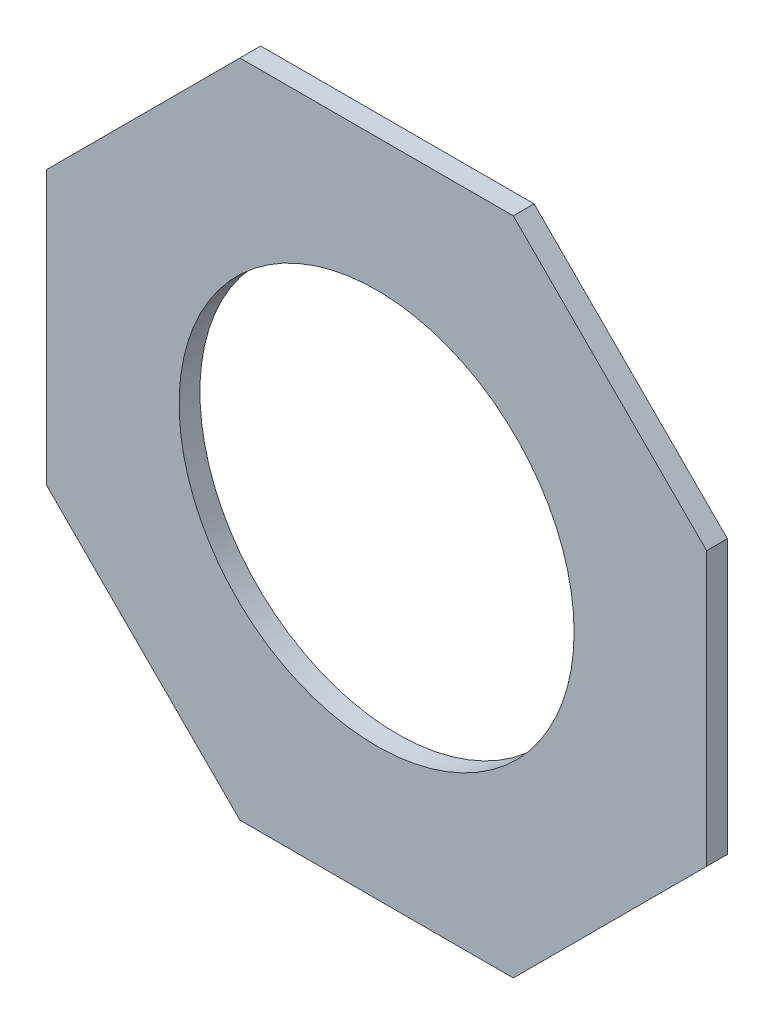
ISO-10303-21;
HEADER;
FILE_DESCRIPTION(('STEP AP214'),'2;1');
FILE_NAME('part.step','',(''),(''),'','','');
FILE_SCHEMA(('AUTOMOTIVE_DESIGN { 1 0 10303 214 1 1 1 1 }'));
ENDSEC;
DATA;
#1=APPLICATION_CONTEXT('core data for automotive mechanical design processes');
#2=APPLICATION_PROTOCOL_DEFINITION('international standard','automotive_design',2000,#1);
#3=PRODUCT_CONTEXT('',#1,'mechanical');
#4=PRODUCT('Part','Part','',(#3));
#5=PRODUCT_RELATED_PRODUCT_CATEGORY('part','',(#4));
#6=PRODUCT_DEFINITION_FORMATION('','',#4);
#7=PRODUCT_DEFINITION_CONTEXT('part definition',#1,'design');
#8=PRODUCT_DEFINITION('design','',#6,#7);
#9=PRODUCT_DEFINITION_SHAPE('','',#8);
#10=(LENGTH_UNIT() NAMED_UNIT(*) SI_UNIT(.MILLI.,.METRE.));
#11=(NAMED_UNIT(*) PLANE_ANGLE_UNIT() SI_UNIT($,.RADIAN.));
#12=(NAMED_UNIT(*) SI_UNIT($,.STERADIAN.) SOLID_ANGLE_UNIT());
#13=UNCERTAINTY_MEASURE_WITH_UNIT(LENGTH_MEASURE(1.E-05),#10,'distance_accuracy_value','');
#14=(GEOMETRIC_REPRESENTATION_CONTEXT(3) GLOBAL_UNCERTAINTY_ASSIGNED_CONTEXT((#13)) GLOBAL_UNIT_ASSIGNED_CONTEXT((#10,
#11,#12)) REPRESENTATION_CONTEXT('',''));
#15=CARTESIAN_POINT('',(0.,0.,0.));
#16=DIRECTION('',(0.,0.,1.));
#17=DIRECTION('',(1.,0.,0.));
#18=AXIS2_PLACEMENT_3D('',#15,#16,#17);
#19=CARTESIAN_POINT('',(0.,0.,1.));
#20=DIRECTION('',(0.,0.,1.));
#21=DIRECTION('',(1.,0.,0.));
#22=AXIS2_PLACEMENT_3D('',#19,#20,#21);
#23=PLANE('',#22);
#24=DIRECTION('',(-0.707106781186547,0.707106781186548,0.));
#25=VECTOR('',#24,1.);
#26=CARTESIAN_POINT('',(15.875,6.57564030267289,1.));
#27=LINE('',#26,#25);
#28=CARTESIAN_POINT('',(15.875,6.57564030267289,1.));
#29=VERTEX_POINT('',#28);
#30=CARTESIAN_POINT('',(6.57564030267289,15.875,1.));
#31=VERTEX_POINT('',#30);
#32=EDGE_CURVE('E145',#29,#31,#27,.T.);
#33=ORIENTED_EDGE('',*,*,#32,.T.);
#34=DIRECTION('',(-1.,0.,0.));
#35=VECTOR('',#34,1.);
#36=CARTESIAN_POINT('',(6.57564030267289,15.875,1.));
#37=LINE('',#36,#35);
#38=CARTESIAN_POINT('',(-6.57564030267288,15.875,1.));
#39=VERTEX_POINT('',#38);
#40=EDGE_CURVE('E93',#31,#39,#37,.T.);
#41=ORIENTED_EDGE('',*,*,#40,.T.);
#42=DIRECTION('',(-0.707106781186548,-0.707106781186548,0.));
#43=VECTOR('',#42,1.);
#44=CARTESIAN_POINT('',(-6.57564030267288,15.875,1.));
#45=LINE('',#44,#43);
#46=CARTESIAN_POINT('',(-15.875,6.57564030267288,1.));
#47=VERTEX_POINT('',#46);
#48=EDGE_CURVE('E160',#39,#47,#45,.T.);
#49=ORIENTED_EDGE('',*,*,#48,.T.);
#50=DIRECTION('',(0.,-1.,0.));
#51=VECTOR('',#50,1.);
#52=CARTESIAN_POINT('',(-15.875,6.57564030267288,1.));
#53=LINE('',#52,#51);
#54=CARTESIAN_POINT('',(-15.875,-6.57564030267288,1.));
#55=VERTEX_POINT('',#54);
#56=EDGE_CURVE('E173',#47,#55,#53,.T.);
#57=ORIENTED_EDGE('',*,*,#56,.T.);
#58=DIRECTION('',(0.707106781186548,-0.707106781186548,0.));
#59=VECTOR('',#58,1.);
#60=CARTESIAN_POINT('',(-15.875,-6.57564030267288,1.));
#61=LINE('',#60,#59);
#62=CARTESIAN_POINT('',(-6.57564030267289,-15.875,1.));
#63=VERTEX_POINT('',#62);
#64=EDGE_CURVE('E112',#55,#63,#61,.T.);
#65=ORIENTED_EDGE('',*,*,#64,.T.);
#66=DIRECTION('',(1.,0.,0.));
#67=VECTOR('',#66,1.);
#68=CARTESIAN_POINT('',(-6.57564030267289,-15.875,1.));
#69=LINE('',#68,#67);
#70=CARTESIAN_POINT('',(6.57564030267288,-15.875,1.));
#71=VERTEX_POINT('',#70);
#72=EDGE_CURVE('E106',#63,#71,#69,.T.);
#73=ORIENTED_EDGE('',*,*,#72,.T.);
#74=DIRECTION('',(0.707106781186548,0.707106781186547,0.));
#75=VECTOR('',#74,1.);
#76=CARTESIAN_POINT('',(6.57564030267288,-15.875,1.));
#77=LINE('',#76,#75);
#78=CARTESIAN_POINT('',(15.875,-6.57564030267289,1.));
#79=VERTEX_POINT('',#78);
#80=EDGE_CURVE('E110',#71,#79,#77,.T.);
#81=ORIENTED_EDGE('',*,*,#80,.T.);
#82=DIRECTION('',(0.,1.,0.));
#83=VECTOR('',#82,1.);
#84=CARTESIAN_POINT('',(15.875,-6.57564030267289,1.));
#85=LINE('',#84,#83);
#86=EDGE_CURVE('E50',#79,#29,#85,.T.);
#87=ORIENTED_EDGE('',*,*,#86,.T.);
#88=EDGE_LOOP('',(#33,#41,#49,#57,#65,#73,#81,#87));
#89=FACE_BOUND('',#88,.T.);
#90=CARTESIAN_POINT('',(0.,0.,1.));
#91=DIRECTION('',(0.,0.,1.));
#92=DIRECTION('',(1.,0.,0.));
#93=AXIS2_PLACEMENT_3D('',#90,#91,#92);
#94=CIRCLE('',#93,9.5);
#95=CARTESIAN_POINT('',(9.5,0.,1.));
#96=VERTEX_POINT('',#95);
#97=EDGE_CURVE('E134',#96,#96,#94,.T.);
#98=ORIENTED_EDGE('',*,*,#97,.F.);
#99=EDGE_LOOP('',(#98));
#100=FACE_BOUND('',#99,.T.);
#101=ADVANCED_FACE('F33',(#89,#100),#23,.T.);
#102=CARTESIAN_POINT('',(0.,0.,0.));
#103=DIRECTION('',(0.,0.,1.));
#104=DIRECTION('',(1.,0.,0.));
#105=AXIS2_PLACEMENT_3D('',#102,#103,#104);
#106=PLANE('',#105);
#107=DIRECTION('',(-0.707106781186547,0.707106781186548,0.));
#108=VECTOR('',#107,1.);
#109=CARTESIAN_POINT('',(15.875,6.57564030267289,0.));
#110=LINE('',#109,#108);
#111=CARTESIAN_POINT('',(15.875,6.57564030267289,0.));
#112=VERTEX_POINT('',#111);
#113=CARTESIAN_POINT('',(6.57564030267289,15.875,0.));
#114=VERTEX_POINT('',#113);
#115=EDGE_CURVE('E130',#112,#114,#110,.T.);
#116=ORIENTED_EDGE('',*,*,#115,.F.);
#117=DIRECTION('',(0.,1.,0.));
#118=VECTOR('',#117,1.);
#119=CARTESIAN_POINT('',(15.875,-6.57564030267289,0.));
#120=LINE('',#119,#118);
#121=CARTESIAN_POINT('',(15.875,-6.57564030267289,0.));
#122=VERTEX_POINT('',#121);
#123=EDGE_CURVE('E85',#122,#112,#120,.T.);
#124=ORIENTED_EDGE('',*,*,#123,.F.);
#125=DIRECTION('',(0.707106781186548,0.707106781186547,0.));
#126=VECTOR('',#125,1.);
#127=CARTESIAN_POINT('',(6.57564030267288,-15.875,0.));
#128=LINE('',#127,#126);
#129=CARTESIAN_POINT('',(6.57564030267288,-15.875,0.));
#130=VERTEX_POINT('',#129);
#131=EDGE_CURVE('E79',#130,#122,#128,.T.);
#132=ORIENTED_EDGE('',*,*,#131,.F.);
#133=DIRECTION('',(1.,0.,0.));
#134=VECTOR('',#133,1.);
#135=CARTESIAN_POINT('',(-6.57564030267289,-15.875,0.));
#136=LINE('',#135,#134);
#137=CARTESIAN_POINT('',(-6.57564030267289,-15.875,0.));
#138=VERTEX_POINT('',#137);
#139=EDGE_CURVE('E120',#138,#130,#136,.T.);
#140=ORIENTED_EDGE('',*,*,#139,.F.);
#141=DIRECTION('',(0.707106781186548,-0.707106781186548,0.));
#142=VECTOR('',#141,1.);
#143=CARTESIAN_POINT('',(-15.875,-6.57564030267288,0.));
#144=LINE('',#143,#142);
#145=CARTESIAN_POINT('',(-15.875,-6.57564030267288,0.));
#146=VERTEX_POINT('',#145);
#147=EDGE_CURVE('E140',#146,#138,#144,.T.);
#148=ORIENTED_EDGE('',*,*,#147,.F.);
#149=DIRECTION('',(0.,-1.,0.));
#150=VECTOR('',#149,1.);
#151=CARTESIAN_POINT('',(-15.875,6.57564030267288,0.));
#152=LINE('',#151,#150);
#153=CARTESIAN_POINT('',(-15.875,6.57564030267288,0.));
#154=VERTEX_POINT('',#153);
#155=EDGE_CURVE('E138',#154,#146,#152,.T.);
#156=ORIENTED_EDGE('',*,*,#155,.F.);
#157=DIRECTION('',(-0.707106781186548,-0.707106781186548,0.));
#158=VECTOR('',#157,1.);
#159=CARTESIAN_POINT('',(-6.57564030267288,15.875,0.));
#160=LINE('',#159,#158);
#161=CARTESIAN_POINT('',(-6.57564030267288,15.875,0.));
#162=VERTEX_POINT('',#161);
#163=EDGE_CURVE('E136',#162,#154,#160,.T.);
#164=ORIENTED_EDGE('',*,*,#163,.F.);
#165=DIRECTION('',(-1.,0.,0.));
#166=VECTOR('',#165,1.);
#167=CARTESIAN_POINT('',(6.57564030267289,15.875,0.));
#168=LINE('',#167,#166);
#169=EDGE_CURVE('E133',#114,#162,#168,.T.);
#170=ORIENTED_EDGE('',*,*,#169,.F.);
#171=EDGE_LOOP('',(#116,#124,#132,#140,#148,#156,#164,#170));
#172=FACE_BOUND('',#171,.T.);
#173=CARTESIAN_POINT('',(0.,0.,0.));
#174=DIRECTION('',(0.,0.,1.));
#175=DIRECTION('',(1.,0.,0.));
#176=AXIS2_PLACEMENT_3D('',#173,#174,#175);
#177=CIRCLE('',#176,9.5);
#178=CARTESIAN_POINT('',(9.5,0.,0.));
#179=VERTEX_POINT('',#178);
#180=EDGE_CURVE('E179',#179,#179,#177,.T.);
#181=ORIENTED_EDGE('',*,*,#180,.T.);
#182=EDGE_LOOP('',(#181));
#183=FACE_BOUND('',#182,.T.);
#184=ADVANCED_FACE('F164',(#172,#183),#106,.F.);
#185=CARTESIAN_POINT('',(15.875,6.57564030267289,1.));
#186=DIRECTION('',(-0.707106781186548,-0.707106781186547,0.));
#187=DIRECTION('',(0.707106781186547,-0.707106781186548,0.));
#188=AXIS2_PLACEMENT_3D('',#185,#186,#187);
#189=PLANE('',#188);
#190=ORIENTED_EDGE('',*,*,#115,.T.);
#191=DIRECTION('',(0.,0.,-1.));
#192=VECTOR('',#191,1.);
#193=CARTESIAN_POINT('',(6.57564030267289,15.875,1.));
#194=LINE('',#193,#192);
#195=EDGE_CURVE('E11',#31,#114,#194,.T.);
#196=ORIENTED_EDGE('',*,*,#195,.F.);
#197=ORIENTED_EDGE('',*,*,#32,.F.);
#198=DIRECTION('',(0.,0.,-1.));
#199=VECTOR('',#198,1.);
#200=CARTESIAN_POINT('',(15.875,6.57564030267289,1.));
#201=LINE('',#200,#199);
#202=EDGE_CURVE('E126',#29,#112,#201,.T.);
#203=ORIENTED_EDGE('',*,*,#202,.T.);
#204=EDGE_LOOP('',(#190,#196,#197,#203));
#205=FACE_BOUND('',#204,.T.);
#206=ADVANCED_FACE('F35',(#205),#189,.F.);
#207=CARTESIAN_POINT('',(6.57564030267289,15.875,1.));
#208=DIRECTION('',(0.,-1.,0.));
#209=DIRECTION('',(0.,0.,-1.));
#210=AXIS2_PLACEMENT_3D('',#207,#208,#209);
#211=PLANE('',#210);
#212=ORIENTED_EDGE('',*,*,#169,.T.);
#213=DIRECTION('',(0.,0.,-1.));
#214=VECTOR('',#213,1.);
#215=CARTESIAN_POINT('',(-6.57564030267288,15.875,1.));
#216=LINE('',#215,#214);
#217=EDGE_CURVE('E42',#39,#162,#216,.T.);
#218=ORIENTED_EDGE('',*,*,#217,.F.);
#219=ORIENTED_EDGE('',*,*,#40,.F.);
#220=ORIENTED_EDGE('',*,*,#195,.T.);
#221=EDGE_LOOP('',(#212,#218,#219,#220));
#222=FACE_BOUND('',#221,.T.);
#223=ADVANCED_FACE('F207',(#222),#211,.F.);
#224=CARTESIAN_POINT('',(-6.57564030267288,15.875,1.));
#225=DIRECTION('',(0.707106781186547,-0.707106781186548,0.));
#226=DIRECTION('',(0.707106781186548,0.707106781186547,0.));
#227=AXIS2_PLACEMENT_3D('',#224,#225,#226);
#228=PLANE('',#227);
#229=ORIENTED_EDGE('',*,*,#163,.T.);
#230=DIRECTION('',(0.,0.,-1.));
#231=VECTOR('',#230,1.);
#232=CARTESIAN_POINT('',(-15.875,6.57564030267288,1.));
#233=LINE('',#232,#231);
#234=EDGE_CURVE('E152',#47,#154,#233,.T.);
#235=ORIENTED_EDGE('',*,*,#234,.F.);
#236=ORIENTED_EDGE('',*,*,#48,.F.);
#237=ORIENTED_EDGE('',*,*,#217,.T.);
#238=EDGE_LOOP('',(#229,#235,#236,#237));
#239=FACE_BOUND('',#238,.T.);
#240=ADVANCED_FACE('F158',(#239),#228,.F.);
#241=CARTESIAN_POINT('',(-15.875,6.57564030267288,1.));
#242=DIRECTION('',(1.,0.,0.));
#243=DIRECTION('',(0.,1.,0.));
#244=AXIS2_PLACEMENT_3D('',#241,#242,#243);
#245=PLANE('',#244);
#246=ORIENTED_EDGE('',*,*,#155,.T.);
#247=DIRECTION('',(0.,0.,-1.));
#248=VECTOR('',#247,1.);
#249=CARTESIAN_POINT('',(-15.875,-6.57564030267288,1.));
#250=LINE('',#249,#248);
#251=EDGE_CURVE('E149',#55,#146,#250,.T.);
#252=ORIENTED_EDGE('',*,*,#251,.F.);
#253=ORIENTED_EDGE('',*,*,#56,.F.);
#254=ORIENTED_EDGE('',*,*,#234,.T.);
#255=EDGE_LOOP('',(#246,#252,#253,#254));
#256=FACE_BOUND('',#255,.T.);
#257=ADVANCED_FACE('F169',(#256),#245,.F.);
#258=CARTESIAN_POINT('',(-15.875,-6.57564030267288,1.));
#259=DIRECTION('',(0.707106781186547,0.707106781186548,0.));
#260=DIRECTION('',(-0.707106781186548,0.707106781186547,0.));
#261=AXIS2_PLACEMENT_3D('',#258,#259,#260);
#262=PLANE('',#261);
#263=ORIENTED_EDGE('',*,*,#147,.T.);
#264=DIRECTION('',(0.,0.,-1.));
#265=VECTOR('',#264,1.);
#266=CARTESIAN_POINT('',(-6.57564030267289,-15.875,1.));
#267=LINE('',#266,#265);
#268=EDGE_CURVE('E121',#63,#138,#267,.T.);
#269=ORIENTED_EDGE('',*,*,#268,.F.);
#270=ORIENTED_EDGE('',*,*,#64,.F.);
#271=ORIENTED_EDGE('',*,*,#251,.T.);
#272=EDGE_LOOP('',(#263,#269,#270,#271));
#273=FACE_BOUND('',#272,.T.);
#274=ADVANCED_FACE('F172',(#273),#262,.F.);
#275=CARTESIAN_POINT('',(-6.57564030267289,-15.875,1.));
#276=DIRECTION('',(0.,1.,0.));
#277=DIRECTION('',(-1.,0.,0.));
#278=AXIS2_PLACEMENT_3D('',#275,#276,#277);
#279=PLANE('',#278);
#280=ORIENTED_EDGE('',*,*,#139,.T.);
#281=DIRECTION('',(0.,0.,-1.));
#282=VECTOR('',#281,1.);
#283=CARTESIAN_POINT('',(6.57564030267288,-15.875,1.));
#284=LINE('',#283,#282);
#285=EDGE_CURVE('E117',#71,#130,#284,.T.);
#286=ORIENTED_EDGE('',*,*,#285,.F.);
#287=ORIENTED_EDGE('',*,*,#72,.F.);
#288=ORIENTED_EDGE('',*,*,#268,.T.);
#289=EDGE_LOOP('',(#280,#286,#287,#288));
#290=FACE_BOUND('',#289,.T.);
#291=ADVANCED_FACE('F118',(#290),#279,.F.);
#292=CARTESIAN_POINT('',(6.57564030267288,-15.875,1.));
#293=DIRECTION('',(-0.707106781186547,0.707106781186548,0.));
#294=DIRECTION('',(-0.707106781186548,-0.707106781186547,0.));
#295=AXIS2_PLACEMENT_3D('',#292,#293,#294);
#296=PLANE('',#295);
#297=ORIENTED_EDGE('',*,*,#131,.T.);
#298=DIRECTION('',(0.,0.,-1.));
#299=VECTOR('',#298,1.);
#300=CARTESIAN_POINT('',(15.875,-6.57564030267289,1.));
#301=LINE('',#300,#299);
#302=EDGE_CURVE('E122',#79,#122,#301,.T.);
#303=ORIENTED_EDGE('',*,*,#302,.F.);
#304=ORIENTED_EDGE('',*,*,#80,.F.);
#305=ORIENTED_EDGE('',*,*,#285,.T.);
#306=EDGE_LOOP('',(#297,#303,#304,#305));
#307=FACE_BOUND('',#306,.T.);
#308=ADVANCED_FACE('F124',(#307),#296,.F.);
#309=CARTESIAN_POINT('',(15.875,-6.57564030267289,1.));
#310=DIRECTION('',(-1.,0.,0.));
#311=DIRECTION('',(0.,-1.,0.));
#312=AXIS2_PLACEMENT_3D('',#309,#310,#311);
#313=PLANE('',#312);
#314=ORIENTED_EDGE('',*,*,#123,.T.);
#315=ORIENTED_EDGE('',*,*,#202,.F.);
#316=ORIENTED_EDGE('',*,*,#86,.F.);
#317=ORIENTED_EDGE('',*,*,#302,.T.);
#318=EDGE_LOOP('',(#314,#315,#316,#317));
#319=FACE_BOUND('',#318,.T.);
#320=ADVANCED_FACE('F195',(#319),#313,.F.);
#321=CARTESIAN_POINT('',(0.,0.,1.));
#322=DIRECTION('',(0.,0.,-1.));
#323=DIRECTION('',(-1.,0.,0.));
#324=AXIS2_PLACEMENT_3D('',#321,#322,#323);
#325=CYLINDRICAL_SURFACE('',#324,9.5);
#326=ORIENTED_EDGE('',*,*,#97,.T.);
#327=EDGE_LOOP('',(#326));
#328=FACE_BOUND('',#327,.T.);
#329=ORIENTED_EDGE('',*,*,#180,.F.);
#330=EDGE_LOOP('',(#329));
#331=FACE_BOUND('',#330,.T.);
#332=ADVANCED_FACE('F185',(#328,#331),#325,.F.);
#333=CLOSED_SHELL('',(#101,#184,#206,#223,#240,#257,#274,#291,#308,#320,#332));
#334=MANIFOLD_SOLID_BREP('B2',#333);
#335=ADVANCED_BREP_SHAPE_REPRESENTATION('',(#18,#334),#14);
#336=SHAPE_DEFINITION_REPRESENTATION(#9,#335);
ENDSEC;
END-ISO-10303-21;
